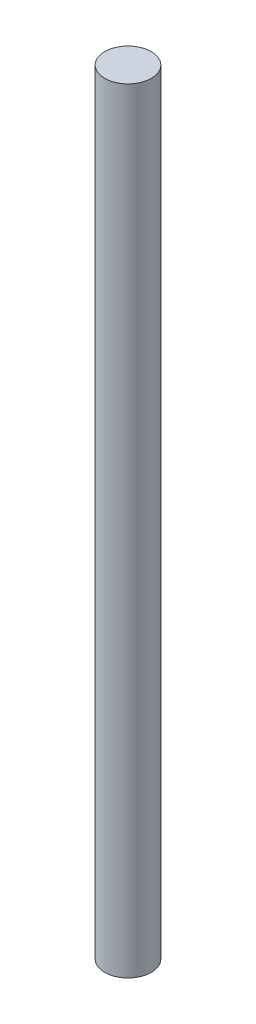
ISO-10303-21;
HEADER;
FILE_DESCRIPTION(('STEP AP214'),'2;1');
FILE_NAME('part.step','',(''),(''),'','','');
FILE_SCHEMA(('AUTOMOTIVE_DESIGN { 1 0 10303 214 1 1 1 1 }'));
ENDSEC;
DATA;
#1=APPLICATION_CONTEXT('core data for automotive mechanical design processes');
#2=APPLICATION_PROTOCOL_DEFINITION('international standard','automotive_design',2000,#1);
#3=PRODUCT_CONTEXT('',#1,'mechanical');
#4=PRODUCT('Part','Part','',(#3));
#5=PRODUCT_RELATED_PRODUCT_CATEGORY('part','',(#4));
#6=PRODUCT_DEFINITION_FORMATION('','',#4);
#7=PRODUCT_DEFINITION_CONTEXT('part definition',#1,'design');
#8=PRODUCT_DEFINITION('design','',#6,#7);
#9=PRODUCT_DEFINITION_SHAPE('','',#8);
#10=(LENGTH_UNIT() NAMED_UNIT(*) SI_UNIT(.MILLI.,.METRE.));
#11=(NAMED_UNIT(*) PLANE_ANGLE_UNIT() SI_UNIT($,.RADIAN.));
#12=(NAMED_UNIT(*) SI_UNIT($,.STERADIAN.) SOLID_ANGLE_UNIT());
#13=UNCERTAINTY_MEASURE_WITH_UNIT(LENGTH_MEASURE(1.E-05),#10,'distance_accuracy_value','');
#14=(GEOMETRIC_REPRESENTATION_CONTEXT(3) GLOBAL_UNCERTAINTY_ASSIGNED_CONTEXT((#13)) GLOBAL_UNIT_ASSIGNED_CONTEXT((#10,
#11,#12)) REPRESENTATION_CONTEXT('',''));
#15=CARTESIAN_POINT('',(0.,0.,0.));
#16=DIRECTION('',(0.,0.,1.));
#17=DIRECTION('',(1.,0.,0.));
#18=AXIS2_PLACEMENT_3D('',#15,#16,#17);
#19=CARTESIAN_POINT('',(0.,70.,0.));
#20=DIRECTION('',(0.,-1.,0.));
#21=DIRECTION('',(0.,0.,-1.));
#22=AXIS2_PLACEMENT_3D('',#19,#20,#21);
#23=CYLINDRICAL_SURFACE('',#22,2.1);
#24=CARTESIAN_POINT('',(0.,70.,0.));
#25=DIRECTION('',(0.,1.,0.));
#26=DIRECTION('',(0.,0.,1.));
#27=AXIS2_PLACEMENT_3D('',#24,#25,#26);
#28=CIRCLE('',#27,2.1);
#29=CARTESIAN_POINT('',(0.,70.,2.1));
#30=VERTEX_POINT('',#29);
#31=EDGE_CURVE('E10',#30,#30,#28,.T.);
#32=ORIENTED_EDGE('',*,*,#31,.F.);
#33=EDGE_LOOP('',(#32));
#34=FACE_BOUND('',#33,.T.);
#35=CARTESIAN_POINT('',(0.,0.,0.));
#36=DIRECTION('',(0.,1.,0.));
#37=DIRECTION('',(0.,0.,1.));
#38=AXIS2_PLACEMENT_3D('',#35,#36,#37);
#39=CIRCLE('',#38,2.1);
#40=CARTESIAN_POINT('',(0.,0.,2.1));
#41=VERTEX_POINT('',#40);
#42=EDGE_CURVE('E36',#41,#41,#39,.T.);
#43=ORIENTED_EDGE('',*,*,#42,.T.);
#44=EDGE_LOOP('',(#43));
#45=FACE_BOUND('',#44,.T.);
#46=ADVANCED_FACE('F33',(#34,#45),#23,.T.);
#47=CARTESIAN_POINT('',(0.,70.,0.));
#48=DIRECTION('',(0.,1.,0.));
#49=DIRECTION('',(0.,0.,1.));
#50=AXIS2_PLACEMENT_3D('',#47,#48,#49);
#51=PLANE('',#50);
#52=ORIENTED_EDGE('',*,*,#31,.T.);
#53=EDGE_LOOP('',(#52));
#54=FACE_BOUND('',#53,.T.);
#55=ADVANCED_FACE('F48',(#54),#51,.T.);
#56=CARTESIAN_POINT('',(0.,0.,0.));
#57=DIRECTION('',(0.,1.,0.));
#58=DIRECTION('',(0.,0.,1.));
#59=AXIS2_PLACEMENT_3D('',#56,#57,#58);
#60=PLANE('',#59);
#61=ORIENTED_EDGE('',*,*,#42,.F.);
#62=EDGE_LOOP('',(#61));
#63=FACE_BOUND('',#62,.T.);
#64=ADVANCED_FACE('F46',(#63),#60,.F.);
#65=CLOSED_SHELL('',(#46,#55,#64));
#66=MANIFOLD_SOLID_BREP('B2',#65);
#67=ADVANCED_BREP_SHAPE_REPRESENTATION('',(#18,#66),#14);
#68=SHAPE_DEFINITION_REPRESENTATION(#9,#67);
ENDSEC;
END-ISO-10303-21;
